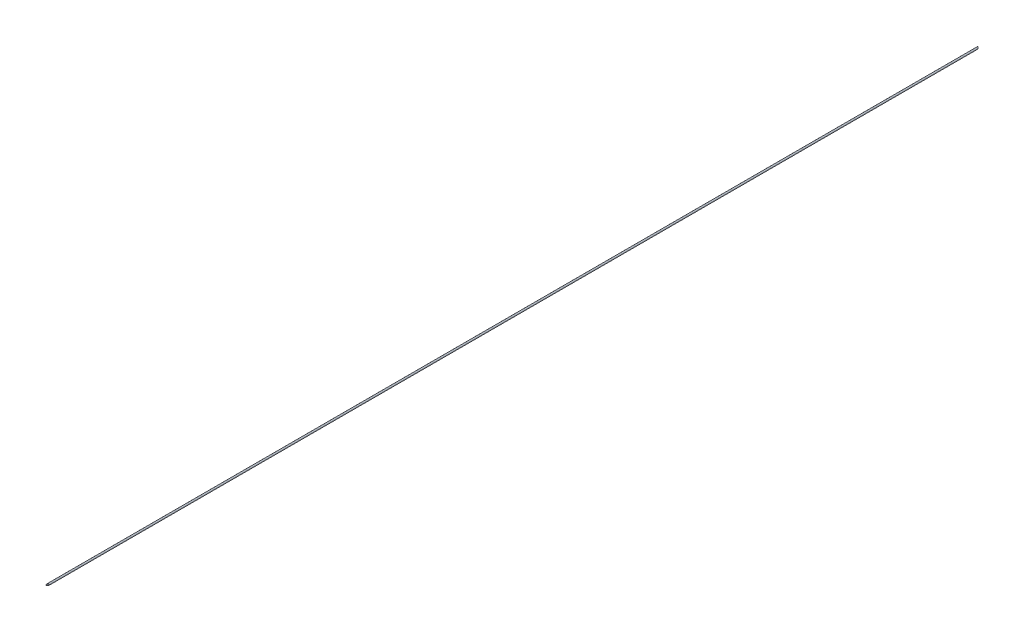
ISO-10303-21;
HEADER;
FILE_DESCRIPTION(('STEP AP214'),'2;1');
FILE_NAME('part.step','',(''),(''),'','','');
FILE_SCHEMA(('AUTOMOTIVE_DESIGN { 1 0 10303 214 1 1 1 1 }'));
ENDSEC;
DATA;
#1=APPLICATION_CONTEXT('core data for automotive mechanical design processes');
#2=APPLICATION_PROTOCOL_DEFINITION('international standard','automotive_design',2000,#1);
#3=PRODUCT_CONTEXT('',#1,'mechanical');
#4=PRODUCT('Part','Part','',(#3));
#5=PRODUCT_RELATED_PRODUCT_CATEGORY('part','',(#4));
#6=PRODUCT_DEFINITION_FORMATION('','',#4);
#7=PRODUCT_DEFINITION_CONTEXT('part definition',#1,'design');
#8=PRODUCT_DEFINITION('design','',#6,#7);
#9=PRODUCT_DEFINITION_SHAPE('','',#8);
#10=(LENGTH_UNIT() NAMED_UNIT(*) SI_UNIT(.MILLI.,.METRE.));
#11=(NAMED_UNIT(*) PLANE_ANGLE_UNIT() SI_UNIT($,.RADIAN.));
#12=(NAMED_UNIT(*) SI_UNIT($,.STERADIAN.) SOLID_ANGLE_UNIT());
#13=UNCERTAINTY_MEASURE_WITH_UNIT(LENGTH_MEASURE(1.E-05),#10,'distance_accuracy_value','');
#14=(GEOMETRIC_REPRESENTATION_CONTEXT(3) GLOBAL_UNCERTAINTY_ASSIGNED_CONTEXT((#13)) GLOBAL_UNIT_ASSIGNED_CONTEXT((#10,
#11,#12)) REPRESENTATION_CONTEXT('',''));
#15=CARTESIAN_POINT('',(0.,0.,0.));
#16=DIRECTION('',(0.,0.,1.));
#17=DIRECTION('',(1.,0.,0.));
#18=AXIS2_PLACEMENT_3D('',#15,#16,#17);
#19=CARTESIAN_POINT('',(0.,0.,2780.));
#20=DIRECTION('',(0.,0.,-1.));
#21=DIRECTION('',(-1.,0.,0.));
#22=AXIS2_PLACEMENT_3D('',#19,#20,#21);
#23=CYLINDRICAL_SURFACE('',#22,4.99999999999989);
#24=CARTESIAN_POINT('',(0.,0.,2775.));
#25=DIRECTION('',(-0.707106781186548,0.,-0.707106781186548));
#26=DIRECTION('',(0.707106781186548,0.,-0.707106781186548));
#27=AXIS2_PLACEMENT_3D('',#24,#25,#26);
#28=ELLIPSE('',#27,7.07106781186532,4.99999999999989);
#29=CARTESIAN_POINT('',(4.99999999999989,0.,2770.));
#30=VERTEX_POINT('',#29);
#31=EDGE_CURVE('E10',#30,#30,#28,.T.);
#32=ORIENTED_EDGE('',*,*,#31,.T.);
#33=EDGE_LOOP('',(#32));
#34=FACE_BOUND('',#33,.T.);
#35=CARTESIAN_POINT('',(0.,0.,-2775.));
#36=DIRECTION('',(0.707106781186548,0.,-0.707106781186548));
#37=DIRECTION('',(-0.707106781186548,0.,-0.707106781186548));
#38=AXIS2_PLACEMENT_3D('',#35,#36,#37);
#39=ELLIPSE('',#38,7.07106781186532,4.99999999999989);
#40=CARTESIAN_POINT('',(-4.99999999999989,0.,-2780.));
#41=VERTEX_POINT('',#40);
#42=EDGE_CURVE('E44',#41,#41,#39,.T.);
#43=ORIENTED_EDGE('',*,*,#42,.F.);
#44=EDGE_LOOP('',(#43));
#45=FACE_BOUND('',#44,.T.);
#46=ADVANCED_FACE('F37',(#34,#45),#23,.T.);
#47=CARTESIAN_POINT('',(-4.99999999999989,-5.,2780.));
#48=DIRECTION('',(-0.707106781186548,0.,-0.707106781186548));
#49=DIRECTION('',(-0.707106781186548,0.,0.707106781186548));
#50=AXIS2_PLACEMENT_3D('',#47,#48,#49);
#51=PLANE('',#50);
#52=ORIENTED_EDGE('',*,*,#31,.F.);
#53=EDGE_LOOP('',(#52));
#54=FACE_BOUND('',#53,.T.);
#55=ADVANCED_FACE('F54',(#54),#51,.F.);
#56=CARTESIAN_POINT('',(-4.99999999999989,-5.,-2780.));
#57=DIRECTION('',(0.707106781186548,0.,-0.707106781186548));
#58=DIRECTION('',(-0.707106781186548,0.,-0.707106781186548));
#59=AXIS2_PLACEMENT_3D('',#56,#57,#58);
#60=PLANE('',#59);
#61=ORIENTED_EDGE('',*,*,#42,.T.);
#62=EDGE_LOOP('',(#61));
#63=FACE_BOUND('',#62,.T.);
#64=ADVANCED_FACE('F51',(#63),#60,.T.);
#65=CLOSED_SHELL('',(#46,#55,#64));
#66=MANIFOLD_SOLID_BREP('B2',#65);
#67=ADVANCED_BREP_SHAPE_REPRESENTATION('',(#18,#66),#14);
#68=SHAPE_DEFINITION_REPRESENTATION(#9,#67);
ENDSEC;
END-ISO-10303-21;
